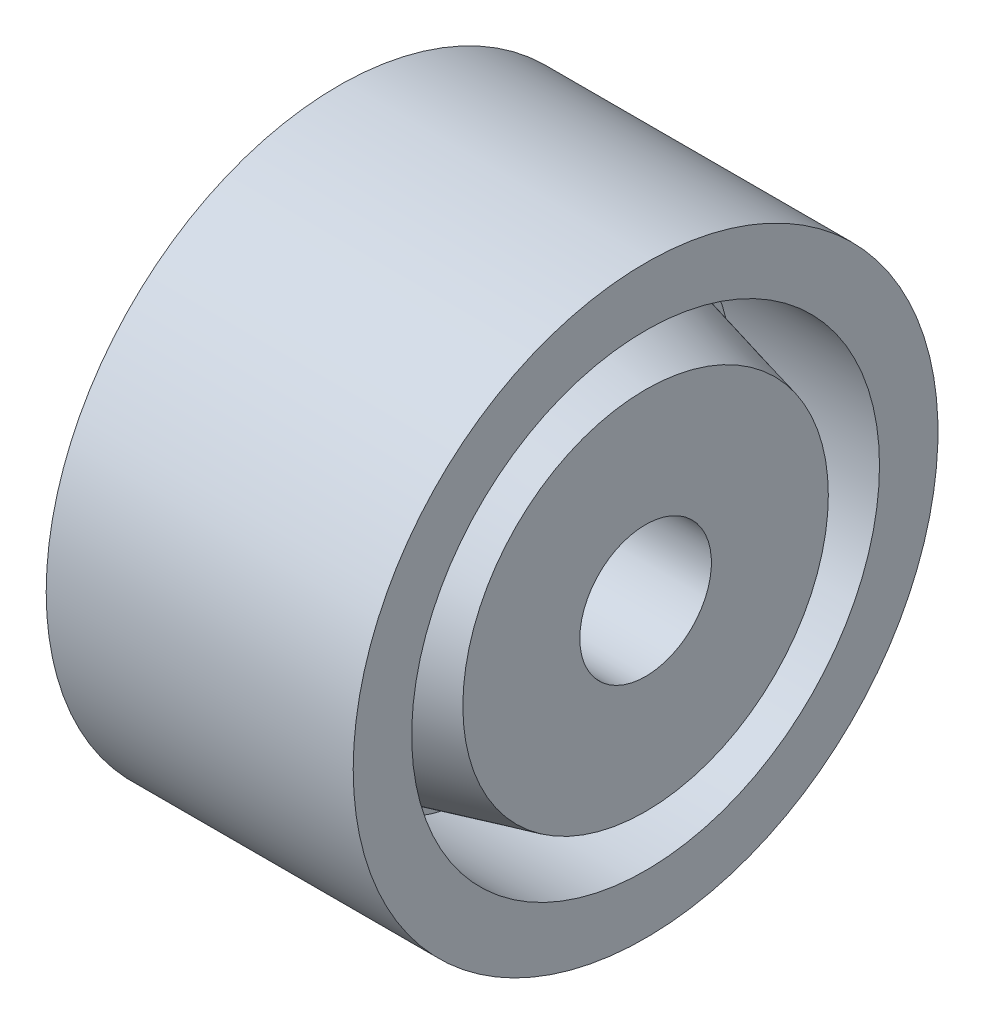
ISO-10303-21;
HEADER;
FILE_DESCRIPTION(('STEP AP214'),'2;1');
FILE_NAME('part.step','',(''),(''),'','','');
FILE_SCHEMA(('AUTOMOTIVE_DESIGN { 1 0 10303 214 1 1 1 1 }'));
ENDSEC;
DATA;
#1=APPLICATION_CONTEXT('core data for automotive mechanical design processes');
#2=APPLICATION_PROTOCOL_DEFINITION('international standard','automotive_design',2000,#1);
#3=PRODUCT_CONTEXT('',#1,'mechanical');
#4=PRODUCT('Part','Part','',(#3));
#5=PRODUCT_RELATED_PRODUCT_CATEGORY('part','',(#4));
#6=PRODUCT_DEFINITION_FORMATION('','',#4);
#7=PRODUCT_DEFINITION_CONTEXT('part definition',#1,'design');
#8=PRODUCT_DEFINITION('design','',#6,#7);
#9=PRODUCT_DEFINITION_SHAPE('','',#8);
#10=(LENGTH_UNIT() NAMED_UNIT(*) SI_UNIT(.MILLI.,.METRE.));
#11=(NAMED_UNIT(*) PLANE_ANGLE_UNIT() SI_UNIT($,.RADIAN.));
#12=(NAMED_UNIT(*) SI_UNIT($,.STERADIAN.) SOLID_ANGLE_UNIT());
#13=UNCERTAINTY_MEASURE_WITH_UNIT(LENGTH_MEASURE(1.E-05),#10,'distance_accuracy_value','');
#14=(GEOMETRIC_REPRESENTATION_CONTEXT(3) GLOBAL_UNCERTAINTY_ASSIGNED_CONTEXT((#13)) GLOBAL_UNIT_ASSIGNED_CONTEXT((#10,
#11,#12)) REPRESENTATION_CONTEXT('',''));
#15=CARTESIAN_POINT('',(0.,0.,0.));
#16=DIRECTION('',(0.,0.,1.));
#17=DIRECTION('',(1.,0.,0.));
#18=AXIS2_PLACEMENT_3D('',#15,#16,#17);
#19=CARTESIAN_POINT('',(42.,0.,0.));
#20=DIRECTION('',(-1.,0.,0.));
#21=DIRECTION('',(0.,0.,1.));
#22=AXIS2_PLACEMENT_3D('',#19,#20,#21);
#23=CYLINDRICAL_SURFACE('',#22,40.);
#24=CARTESIAN_POINT('',(42.,0.,0.));
#25=DIRECTION('',(1.,0.,0.));
#26=DIRECTION('',(0.,0.,-1.));
#27=AXIS2_PLACEMENT_3D('',#24,#25,#26);
#28=CIRCLE('',#27,40.);
#29=CARTESIAN_POINT('',(42.,0.,40.));
#30=VERTEX_POINT('',#29);
#31=EDGE_CURVE('E62',#30,#30,#28,.T.);
#32=CARTESIAN_POINT('',(0.,0.,0.));
#33=DIRECTION('',(1.,0.,0.));
#34=DIRECTION('',(0.,0.,-1.));
#35=AXIS2_PLACEMENT_3D('',#32,#33,#34);
#36=CIRCLE('',#35,40.);
#37=CARTESIAN_POINT('',(0.,0.,40.));
#38=VERTEX_POINT('',#37);
#39=EDGE_CURVE('E67',#38,#38,#36,.T.);
#40=CARTESIAN_POINT('',(42.,0.,40.));
#41=CARTESIAN_POINT('',(41.5625,0.,40.));
#42=CARTESIAN_POINT('',(41.125,0.,40.));
#43=CARTESIAN_POINT('',(40.25,0.,40.));
#44=CARTESIAN_POINT('',(39.8125,0.,40.));
#45=CARTESIAN_POINT('',(38.9375,0.,40.));
#46=CARTESIAN_POINT('',(38.5,0.,40.));
#47=CARTESIAN_POINT('',(37.625,0.,40.));
#48=CARTESIAN_POINT('',(37.1875,0.,40.));
#49=CARTESIAN_POINT('',(36.3125,0.,40.));
#50=CARTESIAN_POINT('',(35.875,0.,40.));
#51=CARTESIAN_POINT('',(35.,0.,40.));
#52=CARTESIAN_POINT('',(34.5625,0.,40.));
#53=CARTESIAN_POINT('',(33.6875,0.,40.));
#54=CARTESIAN_POINT('',(33.25,0.,40.));
#55=CARTESIAN_POINT('',(32.375,0.,40.));
#56=CARTESIAN_POINT('',(31.9375,0.,40.));
#57=CARTESIAN_POINT('',(31.0625,0.,40.));
#58=CARTESIAN_POINT('',(30.625,0.,40.));
#59=CARTESIAN_POINT('',(29.75,0.,40.));
#60=CARTESIAN_POINT('',(29.3125,0.,40.));
#61=CARTESIAN_POINT('',(28.4375,0.,40.));
#62=CARTESIAN_POINT('',(28.,0.,40.));
#63=CARTESIAN_POINT('',(27.125,0.,40.));
#64=CARTESIAN_POINT('',(26.6875,0.,40.));
#65=CARTESIAN_POINT('',(25.8125,0.,40.));
#66=CARTESIAN_POINT('',(25.375,0.,40.));
#67=CARTESIAN_POINT('',(24.5,0.,40.));
#68=CARTESIAN_POINT('',(24.0625,0.,40.));
#69=CARTESIAN_POINT('',(23.1875,0.,40.));
#70=CARTESIAN_POINT('',(22.75,0.,40.));
#71=CARTESIAN_POINT('',(21.875,0.,40.));
#72=CARTESIAN_POINT('',(21.4375,0.,40.));
#73=CARTESIAN_POINT('',(20.5625,0.,40.));
#74=CARTESIAN_POINT('',(20.125,0.,40.));
#75=CARTESIAN_POINT('',(19.25,0.,40.));
#76=CARTESIAN_POINT('',(18.8125,0.,40.));
#77=CARTESIAN_POINT('',(17.9375,0.,40.));
#78=CARTESIAN_POINT('',(17.5,0.,40.));
#79=CARTESIAN_POINT('',(16.625,0.,40.));
#80=CARTESIAN_POINT('',(16.1875,0.,40.));
#81=CARTESIAN_POINT('',(15.3125,0.,40.));
#82=CARTESIAN_POINT('',(14.875,0.,40.));
#83=CARTESIAN_POINT('',(14.,0.,40.));
#84=CARTESIAN_POINT('',(13.5625,0.,40.));
#85=CARTESIAN_POINT('',(12.6875,0.,40.));
#86=CARTESIAN_POINT('',(12.25,0.,40.));
#87=CARTESIAN_POINT('',(11.375,0.,40.));
#88=CARTESIAN_POINT('',(10.9375,0.,40.));
#89=CARTESIAN_POINT('',(10.0625,0.,40.));
#90=CARTESIAN_POINT('',(9.625,0.,40.));
#91=CARTESIAN_POINT('',(8.75,0.,40.));
#92=CARTESIAN_POINT('',(8.3125,0.,40.));
#93=CARTESIAN_POINT('',(7.4375,0.,40.));
#94=CARTESIAN_POINT('',(7.,0.,40.));
#95=CARTESIAN_POINT('',(6.125,0.,40.));
#96=CARTESIAN_POINT('',(5.6875,0.,40.));
#97=CARTESIAN_POINT('',(4.8125,0.,40.));
#98=CARTESIAN_POINT('',(4.375,0.,40.));
#99=CARTESIAN_POINT('',(3.5,0.,40.));
#100=CARTESIAN_POINT('',(3.0625,0.,40.));
#101=CARTESIAN_POINT('',(2.1875,0.,40.));
#102=CARTESIAN_POINT('',(1.75,0.,40.));
#103=CARTESIAN_POINT('',(0.875000000000001,0.,40.));
#104=CARTESIAN_POINT('',(0.4375,0.,40.));
#105=CARTESIAN_POINT('',(0.,0.,40.));
#106=B_SPLINE_CURVE_WITH_KNOTS('',3,(#40,#41,#42,#43,#44,#45,#46,#47,#48,#49,#50,#51,#52,#53,
#54,#55,#56,#57,#58,#59,#60,#61,#62,#63,#64,#65,#66,#67,#68,#69,#70,#71,#72,#73,#74,#75,#76,#77,
#78,#79,#80,#81,#82,#83,#84,#85,#86,#87,#88,#89,#90,#91,#92,#93,#94,#95,#96,#97,#98,#99,#100,
#101,#102,#103,#104,#105),.UNSPECIFIED.,.F.,.F.,(4,2,2,2,2,2,2,2,2,2,2,2,2,2,2,2,2,2,2,2,2,2,2,
2,2,2,2,2,2,2,2,2,4),(0.,1.3125,2.625,3.9375,5.25,6.56250000000001,7.875,9.1875,10.5,11.8125,
13.125,14.4375,15.75,17.0625,18.375,19.6875,21.,22.3125,23.625,24.9375,26.25,27.5625,28.875,
30.1875,31.5,32.8125,34.125,35.4375,36.75,38.0625,39.375,40.6875,42.),.UNSPECIFIED.);
#107=EDGE_CURVE('BSEAM49',#30,#38,#106,.T.);
#108=ORIENTED_EDGE('',*,*,#31,.F.);
#109=ORIENTED_EDGE('',*,*,#39,.T.);
#110=ORIENTED_EDGE('',*,*,#107,.T.);
#111=ORIENTED_EDGE('',*,*,#107,.F.);
#112=EDGE_LOOP('',(#108,#110,#109,#111));
#113=FACE_BOUND('',#112,.T.);
#114=ADVANCED_FACE('F49',(#113),#23,.T.);
#115=CARTESIAN_POINT('',(42.,0.,0.));
#116=DIRECTION('',(1.,0.,0.));
#117=DIRECTION('',(0.,0.,-1.));
#118=AXIS2_PLACEMENT_3D('',#115,#116,#117);
#119=PLANE('',#118);
#120=CARTESIAN_POINT('',(42.,0.,0.));
#121=DIRECTION('',(1.,0.,0.));
#122=DIRECTION('',(0.,0.,-1.));
#123=AXIS2_PLACEMENT_3D('',#120,#121,#122);
#124=CIRCLE('',#123,32.);
#125=CARTESIAN_POINT('',(42.,0.,-32.));
#126=VERTEX_POINT('',#125);
#127=EDGE_CURVE('E75',#126,#126,#124,.T.);
#128=ORIENTED_EDGE('',*,*,#127,.F.);
#129=EDGE_LOOP('',(#128));
#130=FACE_BOUND('',#129,.T.);
#131=ORIENTED_EDGE('',*,*,#31,.T.);
#132=EDGE_LOOP('',(#131));
#133=FACE_BOUND('',#132,.T.);
#134=ADVANCED_FACE('F117',(#130,#133),#119,.T.);
#135=CARTESIAN_POINT('',(0.,0.,0.));
#136=DIRECTION('',(1.,0.,0.));
#137=DIRECTION('',(0.,0.,-1.));
#138=AXIS2_PLACEMENT_3D('',#135,#136,#137);
#139=PLANE('',#138);
#140=CARTESIAN_POINT('',(0.,0.,0.));
#141=DIRECTION('',(1.,0.,0.));
#142=DIRECTION('',(0.,0.,-1.));
#143=AXIS2_PLACEMENT_3D('',#140,#141,#142);
#144=CIRCLE('',#143,32.);
#145=CARTESIAN_POINT('',(0.,0.,-32.));
#146=VERTEX_POINT('',#145);
#147=EDGE_CURVE('E312',#146,#146,#144,.T.);
#148=ORIENTED_EDGE('',*,*,#147,.T.);
#149=EDGE_LOOP('',(#148));
#150=FACE_BOUND('',#149,.T.);
#151=ORIENTED_EDGE('',*,*,#39,.F.);
#152=EDGE_LOOP('',(#151));
#153=FACE_BOUND('',#152,.T.);
#154=ADVANCED_FACE('F115',(#150,#153),#139,.F.);
#155=CARTESIAN_POINT('',(22.,0.,0.));
#156=DIRECTION('',(1.,0.,0.));
#157=DIRECTION('',(0.,0.,-1.));
#158=AXIS2_PLACEMENT_3D('',#155,#156,#157);
#159=CYLINDRICAL_SURFACE('',#158,32.);
#160=CARTESIAN_POINT('',(22.,0.,0.));
#161=DIRECTION('',(1.,0.,0.));
#162=DIRECTION('',(0.,0.,-1.));
#163=AXIS2_PLACEMENT_3D('',#160,#161,#162);
#164=CIRCLE('',#163,32.);
#165=CARTESIAN_POINT('',(22.,0.,-32.));
#166=VERTEX_POINT('',#165);
#167=EDGE_CURVE('E71',#166,#166,#164,.T.);
#168=ORIENTED_EDGE('',*,*,#167,.F.);
#169=EDGE_LOOP('',(#168));
#170=FACE_BOUND('',#169,.T.);
#171=ORIENTED_EDGE('',*,*,#127,.T.);
#172=EDGE_LOOP('',(#171));
#173=FACE_BOUND('',#172,.T.);
#174=ADVANCED_FACE('F111',(#170,#173),#159,.F.);
#175=CARTESIAN_POINT('',(22.,0.,0.));
#176=DIRECTION('',(1.,0.,0.));
#177=DIRECTION('',(0.,0.,-1.));
#178=AXIS2_PLACEMENT_3D('',#175,#176,#177);
#179=PLANE('',#178);
#180=CARTESIAN_POINT('',(22.,0.,0.));
#181=DIRECTION('',(-1.,0.,0.));
#182=DIRECTION('',(0.,0.,1.));
#183=AXIS2_PLACEMENT_3D('',#180,#181,#182);
#184=CIRCLE('',#183,30.);
#185=CARTESIAN_POINT('',(22.,0.,30.));
#186=VERTEX_POINT('',#185);
#187=EDGE_CURVE('E57',#186,#186,#184,.F.);
#188=ORIENTED_EDGE('',*,*,#187,.F.);
#189=EDGE_LOOP('',(#188));
#190=FACE_BOUND('',#189,.T.);
#191=ORIENTED_EDGE('',*,*,#167,.T.);
#192=EDGE_LOOP('',(#191));
#193=FACE_BOUND('',#192,.T.);
#194=ADVANCED_FACE('F105',(#190,#193),#179,.T.);
#195=CARTESIAN_POINT('',(42.,0.,0.));
#196=DIRECTION('',(1.,0.,0.));
#197=DIRECTION('',(0.,0.,-1.));
#198=AXIS2_PLACEMENT_3D('',#195,#196,#197);
#199=PLANE('',#198);
#200=CARTESIAN_POINT('',(42.,0.,0.));
#201=DIRECTION('',(-1.,0.,0.));
#202=DIRECTION('',(0.,0.,1.));
#203=AXIS2_PLACEMENT_3D('',#200,#201,#202);
#204=CIRCLE('',#203,9.);
#205=CARTESIAN_POINT('',(42.,0.,9.));
#206=VERTEX_POINT('',#205);
#207=EDGE_CURVE('E338',#206,#206,#204,.T.);
#208=ORIENTED_EDGE('',*,*,#207,.T.);
#209=EDGE_LOOP('',(#208));
#210=FACE_BOUND('',#209,.T.);
#211=CARTESIAN_POINT('',(42.,0.,0.));
#212=DIRECTION('',(1.,0.,0.));
#213=DIRECTION('',(0.,0.,-1.));
#214=AXIS2_PLACEMENT_3D('',#211,#212,#213);
#215=CIRCLE('',#214,25.);
#216=CARTESIAN_POINT('',(42.,0.,-25.));
#217=VERTEX_POINT('',#216);
#218=EDGE_CURVE('E79',#217,#217,#215,.T.);
#219=ORIENTED_EDGE('',*,*,#218,.T.);
#220=EDGE_LOOP('',(#219));
#221=FACE_BOUND('',#220,.T.);
#222=ADVANCED_FACE('F94',(#210,#221),#199,.T.);
#223=CARTESIAN_POINT('',(42.,0.,0.));
#224=DIRECTION('',(-1.,0.,0.));
#225=DIRECTION('',(0.,0.,1.));
#226=AXIS2_PLACEMENT_3D('',#223,#224,#225);
#227=CONICAL_SURFACE('',#226,25.,0.244978663126864);
#228=ORIENTED_EDGE('',*,*,#187,.T.);
#229=EDGE_LOOP('',(#228));
#230=FACE_BOUND('',#229,.T.);
#231=ORIENTED_EDGE('',*,*,#218,.F.);
#232=EDGE_LOOP('',(#231));
#233=FACE_BOUND('',#232,.T.);
#234=ADVANCED_FACE('F104',(#230,#233),#227,.T.);
#235=CARTESIAN_POINT('',(20.,0.,0.));
#236=DIRECTION('',(-1.,0.,0.));
#237=DIRECTION('',(0.,0.,1.));
#238=AXIS2_PLACEMENT_3D('',#235,#236,#237);
#239=CYLINDRICAL_SURFACE('',#238,32.);
#240=CARTESIAN_POINT('',(20.,0.,0.));
#241=DIRECTION('',(1.,0.,0.));
#242=DIRECTION('',(0.,0.,-1.));
#243=AXIS2_PLACEMENT_3D('',#240,#241,#242);
#244=CIRCLE('',#243,32.);
#245=CARTESIAN_POINT('',(20.,0.,-32.));
#246=VERTEX_POINT('',#245);
#247=EDGE_CURVE('E88',#246,#246,#244,.T.);
#248=ORIENTED_EDGE('',*,*,#247,.T.);
#249=EDGE_LOOP('',(#248));
#250=FACE_BOUND('',#249,.T.);
#251=ORIENTED_EDGE('',*,*,#147,.F.);
#252=EDGE_LOOP('',(#251));
#253=FACE_BOUND('',#252,.T.);
#254=ADVANCED_FACE('F150',(#250,#253),#239,.F.);
#255=CARTESIAN_POINT('',(20.,0.,0.));
#256=DIRECTION('',(-1.,0.,0.));
#257=DIRECTION('',(0.,0.,-1.));
#258=AXIS2_PLACEMENT_3D('',#255,#256,#257);
#259=PLANE('',#258);
#260=CARTESIAN_POINT('',(20.,0.,0.));
#261=DIRECTION('',(1.,0.,0.));
#262=DIRECTION('',(0.,0.,-1.));
#263=AXIS2_PLACEMENT_3D('',#260,#261,#262);
#264=CIRCLE('',#263,30.);
#265=CARTESIAN_POINT('',(20.,0.,-30.));
#266=VERTEX_POINT('',#265);
#267=EDGE_CURVE('E11',#266,#266,#264,.F.);
#268=ORIENTED_EDGE('',*,*,#267,.F.);
#269=EDGE_LOOP('',(#268));
#270=FACE_BOUND('',#269,.T.);
#271=ORIENTED_EDGE('',*,*,#247,.F.);
#272=EDGE_LOOP('',(#271));
#273=FACE_BOUND('',#272,.T.);
#274=ADVANCED_FACE('F173',(#270,#273),#259,.T.);
#275=CARTESIAN_POINT('',(0.,0.,0.));
#276=DIRECTION('',(-1.,0.,0.));
#277=DIRECTION('',(0.,0.,-1.));
#278=AXIS2_PLACEMENT_3D('',#275,#276,#277);
#279=PLANE('',#278);
#280=CARTESIAN_POINT('',(0.,0.,0.));
#281=DIRECTION('',(-1.,0.,0.));
#282=DIRECTION('',(0.,0.,1.));
#283=AXIS2_PLACEMENT_3D('',#280,#281,#282);
#284=CIRCLE('',#283,9.);
#285=CARTESIAN_POINT('',(0.,0.,9.));
#286=VERTEX_POINT('',#285);
#287=EDGE_CURVE('E331',#286,#286,#284,.T.);
#288=ORIENTED_EDGE('',*,*,#287,.F.);
#289=EDGE_LOOP('',(#288));
#290=FACE_BOUND('',#289,.T.);
#291=CARTESIAN_POINT('',(0.,0.,0.));
#292=DIRECTION('',(1.,0.,0.));
#293=DIRECTION('',(0.,0.,1.));
#294=AXIS2_PLACEMENT_3D('',#291,#292,#293);
#295=CIRCLE('',#294,25.);
#296=CARTESIAN_POINT('',(0.,0.,25.));
#297=VERTEX_POINT('',#296);
#298=EDGE_CURVE('E300',#297,#297,#295,.T.);
#299=ORIENTED_EDGE('',*,*,#298,.F.);
#300=EDGE_LOOP('',(#299));
#301=FACE_BOUND('',#300,.T.);
#302=ADVANCED_FACE('F167',(#290,#301),#279,.T.);
#303=CARTESIAN_POINT('',(0.,0.,0.));
#304=DIRECTION('',(1.,0.,0.));
#305=DIRECTION('',(0.,0.,1.));
#306=AXIS2_PLACEMENT_3D('',#303,#304,#305);
#307=CONICAL_SURFACE('',#306,25.,0.244978663126864);
#308=ORIENTED_EDGE('',*,*,#267,.T.);
#309=EDGE_LOOP('',(#308));
#310=FACE_BOUND('',#309,.T.);
#311=ORIENTED_EDGE('',*,*,#298,.T.);
#312=EDGE_LOOP('',(#311));
#313=FACE_BOUND('',#312,.T.);
#314=ADVANCED_FACE('F172',(#310,#313),#307,.T.);
#315=CARTESIAN_POINT('',(13.,0.,0.));
#316=DIRECTION('',(-1.,0.,0.));
#317=DIRECTION('',(0.,0.,1.));
#318=AXIS2_PLACEMENT_3D('',#315,#316,#317);
#319=CYLINDRICAL_SURFACE('',#318,9.);
#320=CARTESIAN_POINT('',(13.,0.,0.));
#321=DIRECTION('',(-1.,0.,0.));
#322=DIRECTION('',(0.,0.,1.));
#323=AXIS2_PLACEMENT_3D('',#320,#321,#322);
#324=CIRCLE('',#323,9.);
#325=CARTESIAN_POINT('',(13.,0.,9.));
#326=VERTEX_POINT('',#325);
#327=EDGE_CURVE('E327',#326,#326,#324,.T.);
#328=ORIENTED_EDGE('',*,*,#327,.F.);
#329=EDGE_LOOP('',(#328));
#330=FACE_BOUND('',#329,.T.);
#331=ORIENTED_EDGE('',*,*,#287,.T.);
#332=EDGE_LOOP('',(#331));
#333=FACE_BOUND('',#332,.T.);
#334=ADVANCED_FACE('F189',(#330,#333),#319,.F.);
#335=CARTESIAN_POINT('',(13.,0.,0.));
#336=DIRECTION('',(-1.,0.,0.));
#337=DIRECTION('',(0.,0.,1.));
#338=AXIS2_PLACEMENT_3D('',#335,#336,#337);
#339=PLANE('',#338);
#340=ORIENTED_EDGE('',*,*,#327,.T.);
#341=EDGE_LOOP('',(#340));
#342=FACE_BOUND('',#341,.T.);
#343=ADVANCED_FACE('F183',(#342),#339,.T.);
#344=CARTESIAN_POINT('',(29.,0.,0.));
#345=DIRECTION('',(1.,0.,0.));
#346=DIRECTION('',(0.,0.,-1.));
#347=AXIS2_PLACEMENT_3D('',#344,#345,#346);
#348=CYLINDRICAL_SURFACE('',#347,9.);
#349=CARTESIAN_POINT('',(29.,0.,0.));
#350=DIRECTION('',(-1.,0.,0.));
#351=DIRECTION('',(0.,0.,1.));
#352=AXIS2_PLACEMENT_3D('',#349,#350,#351);
#353=CIRCLE('',#352,9.);
#354=CARTESIAN_POINT('',(29.,0.,9.));
#355=VERTEX_POINT('',#354);
#356=EDGE_CURVE('E336',#355,#355,#353,.T.);
#357=ORIENTED_EDGE('',*,*,#356,.T.);
#358=EDGE_LOOP('',(#357));
#359=FACE_BOUND('',#358,.T.);
#360=ORIENTED_EDGE('',*,*,#207,.F.);
#361=EDGE_LOOP('',(#360));
#362=FACE_BOUND('',#361,.T.);
#363=ADVANCED_FACE('F188',(#359,#362),#348,.F.);
#364=CARTESIAN_POINT('',(29.,0.,0.));
#365=DIRECTION('',(1.,0.,0.));
#366=DIRECTION('',(0.,0.,1.));
#367=AXIS2_PLACEMENT_3D('',#364,#365,#366);
#368=PLANE('',#367);
#369=ORIENTED_EDGE('',*,*,#356,.F.);
#370=EDGE_LOOP('',(#369));
#371=FACE_BOUND('',#370,.T.);
#372=ADVANCED_FACE('F231',(#371),#368,.T.);
#373=CLOSED_SHELL('',(#114,#134,#154,#174,#194,#222,#234,#254,#274,#302,#314,#334,#343,#363,#372));
#374=MANIFOLD_SOLID_BREP('B2',#373);
#375=ADVANCED_BREP_SHAPE_REPRESENTATION('',(#18,#374),#14);
#376=SHAPE_DEFINITION_REPRESENTATION(#9,#375);
ENDSEC;
END-ISO-10303-21;
